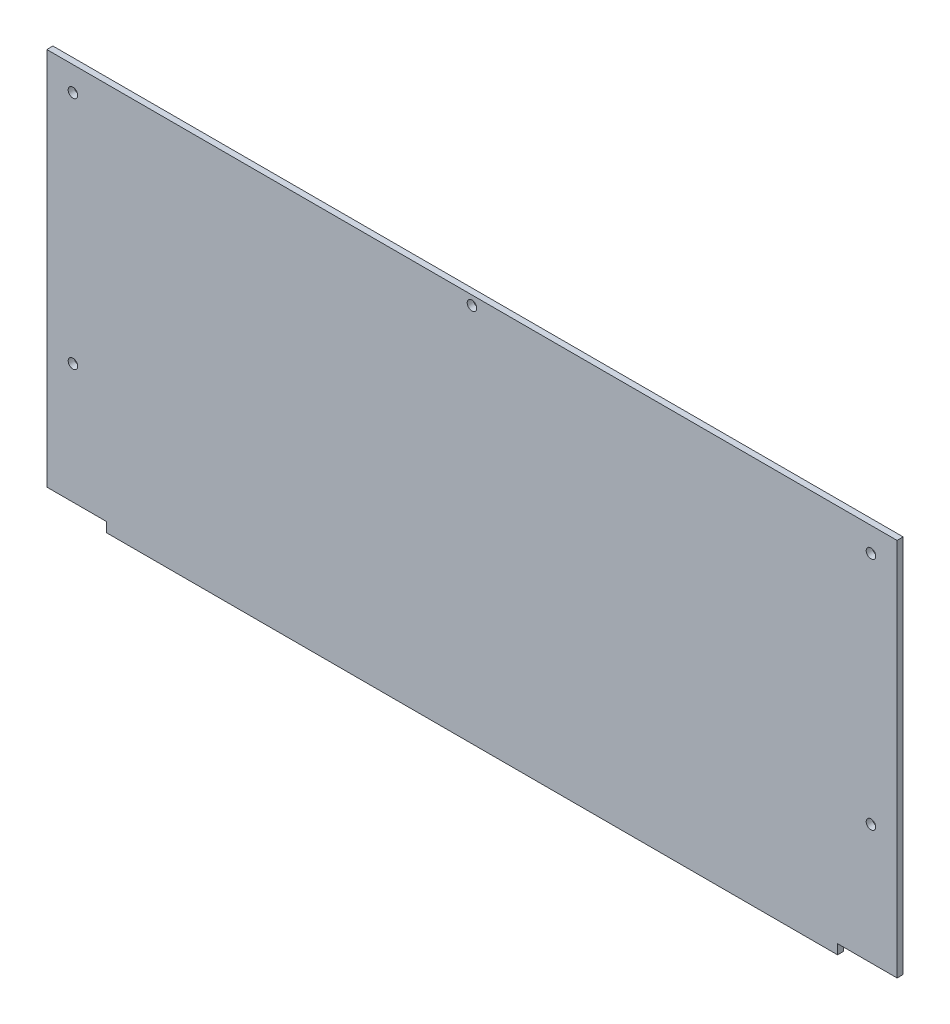
ISO-10303-21;
HEADER;
FILE_DESCRIPTION(('STEP AP214'),'2;1');
FILE_NAME('part.step','',(''),(''),'','','');
FILE_SCHEMA(('AUTOMOTIVE_DESIGN { 1 0 10303 214 1 1 1 1 }'));
ENDSEC;
DATA;
#1=APPLICATION_CONTEXT('core data for automotive mechanical design processes');
#2=APPLICATION_PROTOCOL_DEFINITION('international standard','automotive_design',2000,#1);
#3=PRODUCT_CONTEXT('',#1,'mechanical');
#4=PRODUCT('Part','Part','',(#3));
#5=PRODUCT_RELATED_PRODUCT_CATEGORY('part','',(#4));
#6=PRODUCT_DEFINITION_FORMATION('','',#4);
#7=PRODUCT_DEFINITION_CONTEXT('part definition',#1,'design');
#8=PRODUCT_DEFINITION('design','',#6,#7);
#9=PRODUCT_DEFINITION_SHAPE('','',#8);
#10=(LENGTH_UNIT() NAMED_UNIT(*) SI_UNIT(.MILLI.,.METRE.));
#11=(NAMED_UNIT(*) PLANE_ANGLE_UNIT() SI_UNIT($,.RADIAN.));
#12=(NAMED_UNIT(*) SI_UNIT($,.STERADIAN.) SOLID_ANGLE_UNIT());
#13=UNCERTAINTY_MEASURE_WITH_UNIT(LENGTH_MEASURE(1.E-05),#10,'distance_accuracy_value','');
#14=(GEOMETRIC_REPRESENTATION_CONTEXT(3) GLOBAL_UNCERTAINTY_ASSIGNED_CONTEXT((#13)) GLOBAL_UNIT_ASSIGNED_CONTEXT((#10,
#11,#12)) REPRESENTATION_CONTEXT('',''));
#15=CARTESIAN_POINT('',(0.,0.,0.));
#16=DIRECTION('',(0.,0.,1.));
#17=DIRECTION('',(1.,0.,0.));
#18=AXIS2_PLACEMENT_3D('',#15,#16,#17);
#19=CARTESIAN_POINT('',(0.,0.,-1.5875));
#20=DIRECTION('',(0.,0.,1.));
#21=DIRECTION('',(1.,0.,0.));
#22=AXIS2_PLACEMENT_3D('',#19,#20,#21);
#23=PLANE('',#22);
#24=CARTESIAN_POINT('',(0.,96.8375,-1.5875));
#25=DIRECTION('',(0.,0.,-1.));
#26=DIRECTION('',(-1.,0.,0.));
#27=AXIS2_PLACEMENT_3D('',#24,#25,#26);
#28=CIRCLE('',#27,2.48919999999999);
#29=CARTESIAN_POINT('',(-2.48919999999999,96.8375,-1.5875));
#30=VERTEX_POINT('',#29);
#31=EDGE_CURVE('E203',#30,#30,#28,.T.);
#32=ORIENTED_EDGE('',*,*,#31,.F.);
#33=EDGE_LOOP('',(#32));
#34=FACE_BOUND('',#33,.T.);
#35=CARTESIAN_POINT('',(208.5975,88.9,-1.5875));
#36=DIRECTION('',(0.,0.,-1.));
#37=DIRECTION('',(-1.,0.,0.));
#38=AXIS2_PLACEMENT_3D('',#35,#36,#37);
#39=CIRCLE('',#38,2.4892);
#40=CARTESIAN_POINT('',(206.1083,88.9,-1.5875));
#41=VERTEX_POINT('',#40);
#42=EDGE_CURVE('E197',#41,#41,#39,.T.);
#43=ORIENTED_EDGE('',*,*,#42,.F.);
#44=EDGE_LOOP('',(#43));
#45=FACE_BOUND('',#44,.T.);
#46=CARTESIAN_POINT('',(208.5975,-33.782,-1.5875));
#47=DIRECTION('',(0.,0.,-1.));
#48=DIRECTION('',(-1.,0.,0.));
#49=AXIS2_PLACEMENT_3D('',#46,#47,#48);
#50=CIRCLE('',#49,2.4892);
#51=CARTESIAN_POINT('',(206.1083,-33.782,-1.5875));
#52=VERTEX_POINT('',#51);
#53=EDGE_CURVE('E191',#52,#52,#50,.T.);
#54=ORIENTED_EDGE('',*,*,#53,.F.);
#55=EDGE_LOOP('',(#54));
#56=FACE_BOUND('',#55,.T.);
#57=DIRECTION('',(0.,1.,0.));
#58=VECTOR('',#57,1.);
#59=CARTESIAN_POINT('',(222.25,-101.6,-1.5875));
#60=LINE('',#59,#58);
#61=CARTESIAN_POINT('',(222.25,-96.52,-1.5875));
#62=VERTEX_POINT('',#61);
#63=CARTESIAN_POINT('',(222.25,101.6,-1.5875));
#64=VERTEX_POINT('',#63);
#65=EDGE_CURVE('E142',#62,#64,#60,.T.);
#66=ORIENTED_EDGE('',*,*,#65,.F.);
#67=DIRECTION('',(1.,0.,0.));
#68=VECTOR('',#67,1.);
#69=CARTESIAN_POINT('',(191.135,-96.52,-1.5875));
#70=LINE('',#69,#68);
#71=CARTESIAN_POINT('',(191.135,-96.52,-1.5875));
#72=VERTEX_POINT('',#71);
#73=EDGE_CURVE('E110',#72,#62,#70,.T.);
#74=ORIENTED_EDGE('',*,*,#73,.F.);
#75=DIRECTION('',(0.,1.,0.));
#76=VECTOR('',#75,1.);
#77=CARTESIAN_POINT('',(191.135,-101.6,-1.5875));
#78=LINE('',#77,#76);
#79=CARTESIAN_POINT('',(191.135,-101.6,-1.5875));
#80=VERTEX_POINT('',#79);
#81=EDGE_CURVE('E161',#80,#72,#78,.T.);
#82=ORIENTED_EDGE('',*,*,#81,.F.);
#83=DIRECTION('',(1.,0.,0.));
#84=VECTOR('',#83,1.);
#85=CARTESIAN_POINT('',(-222.25,-101.6,-1.5875));
#86=LINE('',#85,#84);
#87=CARTESIAN_POINT('',(-191.135,-101.6,-1.5875));
#88=VERTEX_POINT('',#87);
#89=EDGE_CURVE('E118',#88,#80,#86,.T.);
#90=ORIENTED_EDGE('',*,*,#89,.F.);
#91=DIRECTION('',(0.,-1.,0.));
#92=VECTOR('',#91,1.);
#93=CARTESIAN_POINT('',(-191.135,-96.52,-1.5875));
#94=LINE('',#93,#92);
#95=CARTESIAN_POINT('',(-191.135,-96.52,-1.5875));
#96=VERTEX_POINT('',#95);
#97=EDGE_CURVE('E159',#96,#88,#94,.T.);
#98=ORIENTED_EDGE('',*,*,#97,.F.);
#99=DIRECTION('',(1.,0.,0.));
#100=VECTOR('',#99,1.);
#101=CARTESIAN_POINT('',(-222.25,-96.52,-1.5875));
#102=LINE('',#101,#100);
#103=CARTESIAN_POINT('',(-222.25,-96.52,-1.5875));
#104=VERTEX_POINT('',#103);
#105=EDGE_CURVE('E158',#104,#96,#102,.T.);
#106=ORIENTED_EDGE('',*,*,#105,.F.);
#107=DIRECTION('',(0.,-1.,0.));
#108=VECTOR('',#107,1.);
#109=CARTESIAN_POINT('',(-222.25,-101.6,-1.5875));
#110=LINE('',#109,#108);
#111=CARTESIAN_POINT('',(-222.25,101.6,-1.5875));
#112=VERTEX_POINT('',#111);
#113=EDGE_CURVE('E127',#112,#104,#110,.T.);
#114=ORIENTED_EDGE('',*,*,#113,.F.);
#115=DIRECTION('',(-1.,0.,0.));
#116=VECTOR('',#115,1.);
#117=CARTESIAN_POINT('',(-222.25,101.6,-1.5875));
#118=LINE('',#117,#116);
#119=EDGE_CURVE('E132',#64,#112,#118,.T.);
#120=ORIENTED_EDGE('',*,*,#119,.F.);
#121=EDGE_LOOP('',(#66,#74,#82,#90,#98,#106,#114,#120));
#122=FACE_BOUND('',#121,.T.);
#123=CARTESIAN_POINT('',(-208.5975,-33.782,-1.5875));
#124=DIRECTION('',(0.,0.,-1.));
#125=DIRECTION('',(-1.,0.,0.));
#126=AXIS2_PLACEMENT_3D('',#123,#124,#125);
#127=CIRCLE('',#126,2.4892);
#128=CARTESIAN_POINT('',(-211.0867,-33.782,-1.5875));
#129=VERTEX_POINT('',#128);
#130=EDGE_CURVE('E179',#129,#129,#127,.T.);
#131=ORIENTED_EDGE('',*,*,#130,.F.);
#132=EDGE_LOOP('',(#131));
#133=FACE_BOUND('',#132,.T.);
#134=CARTESIAN_POINT('',(-208.5975,88.8999999999999,-1.5875));
#135=DIRECTION('',(0.,0.,-1.));
#136=DIRECTION('',(-1.,0.,0.));
#137=AXIS2_PLACEMENT_3D('',#134,#135,#136);
#138=CIRCLE('',#137,2.4892);
#139=CARTESIAN_POINT('',(-211.0867,88.8999999999999,-1.5875));
#140=VERTEX_POINT('',#139);
#141=EDGE_CURVE('E185',#140,#140,#138,.T.);
#142=ORIENTED_EDGE('',*,*,#141,.F.);
#143=EDGE_LOOP('',(#142));
#144=FACE_BOUND('',#143,.T.);
#145=ADVANCED_FACE('F37',(#34,#45,#56,#122,#133,#144),#23,.F.);
#146=CARTESIAN_POINT('',(0.,0.,1.5875));
#147=DIRECTION('',(0.,0.,1.));
#148=DIRECTION('',(1.,0.,0.));
#149=AXIS2_PLACEMENT_3D('',#146,#147,#148);
#150=PLANE('',#149);
#151=CARTESIAN_POINT('',(0.,96.8375,1.5875));
#152=DIRECTION('',(0.,0.,-1.));
#153=DIRECTION('',(-1.,0.,0.));
#154=AXIS2_PLACEMENT_3D('',#151,#152,#153);
#155=CIRCLE('',#154,2.48919999999999);
#156=CARTESIAN_POINT('',(-2.48919999999999,96.8375,1.5875));
#157=VERTEX_POINT('',#156);
#158=EDGE_CURVE('E200',#157,#157,#155,.T.);
#159=ORIENTED_EDGE('',*,*,#158,.T.);
#160=EDGE_LOOP('',(#159));
#161=FACE_BOUND('',#160,.T.);
#162=CARTESIAN_POINT('',(208.5975,88.9,1.5875));
#163=DIRECTION('',(0.,0.,-1.));
#164=DIRECTION('',(-1.,0.,0.));
#165=AXIS2_PLACEMENT_3D('',#162,#163,#164);
#166=CIRCLE('',#165,2.4892);
#167=CARTESIAN_POINT('',(206.1083,88.9,1.5875));
#168=VERTEX_POINT('',#167);
#169=EDGE_CURVE('E194',#168,#168,#166,.T.);
#170=ORIENTED_EDGE('',*,*,#169,.T.);
#171=EDGE_LOOP('',(#170));
#172=FACE_BOUND('',#171,.T.);
#173=CARTESIAN_POINT('',(208.5975,-33.782,1.5875));
#174=DIRECTION('',(0.,0.,-1.));
#175=DIRECTION('',(-1.,0.,0.));
#176=AXIS2_PLACEMENT_3D('',#173,#174,#175);
#177=CIRCLE('',#176,2.4892);
#178=CARTESIAN_POINT('',(206.1083,-33.782,1.5875));
#179=VERTEX_POINT('',#178);
#180=EDGE_CURVE('E188',#179,#179,#177,.T.);
#181=ORIENTED_EDGE('',*,*,#180,.T.);
#182=EDGE_LOOP('',(#181));
#183=FACE_BOUND('',#182,.T.);
#184=DIRECTION('',(1.,0.,0.));
#185=VECTOR('',#184,1.);
#186=CARTESIAN_POINT('',(191.135,-96.52,1.5875));
#187=LINE('',#186,#185);
#188=CARTESIAN_POINT('',(191.135,-96.52,1.5875));
#189=VERTEX_POINT('',#188);
#190=CARTESIAN_POINT('',(222.25,-96.52,1.5875));
#191=VERTEX_POINT('',#190);
#192=EDGE_CURVE('E109',#189,#191,#187,.T.);
#193=ORIENTED_EDGE('',*,*,#192,.T.);
#194=DIRECTION('',(0.,1.,0.));
#195=VECTOR('',#194,1.);
#196=CARTESIAN_POINT('',(222.25,-101.6,1.5875));
#197=LINE('',#196,#195);
#198=CARTESIAN_POINT('',(222.25,101.6,1.5875));
#199=VERTEX_POINT('',#198);
#200=EDGE_CURVE('E126',#191,#199,#197,.T.);
#201=ORIENTED_EDGE('',*,*,#200,.T.);
#202=DIRECTION('',(-1.,0.,0.));
#203=VECTOR('',#202,1.);
#204=CARTESIAN_POINT('',(-222.25,101.6,1.5875));
#205=LINE('',#204,#203);
#206=CARTESIAN_POINT('',(-222.25,101.6,1.5875));
#207=VERTEX_POINT('',#206);
#208=EDGE_CURVE('E129',#199,#207,#205,.T.);
#209=ORIENTED_EDGE('',*,*,#208,.T.);
#210=DIRECTION('',(0.,-1.,0.));
#211=VECTOR('',#210,1.);
#212=CARTESIAN_POINT('',(-222.25,-101.6,1.5875));
#213=LINE('',#212,#211);
#214=CARTESIAN_POINT('',(-222.25,-96.52,1.5875));
#215=VERTEX_POINT('',#214);
#216=EDGE_CURVE('E138',#207,#215,#213,.T.);
#217=ORIENTED_EDGE('',*,*,#216,.T.);
#218=DIRECTION('',(1.,0.,0.));
#219=VECTOR('',#218,1.);
#220=CARTESIAN_POINT('',(-222.25,-96.52,1.5875));
#221=LINE('',#220,#219);
#222=CARTESIAN_POINT('',(-191.135,-96.52,1.5875));
#223=VERTEX_POINT('',#222);
#224=EDGE_CURVE('E163',#215,#223,#221,.T.);
#225=ORIENTED_EDGE('',*,*,#224,.T.);
#226=DIRECTION('',(0.,-1.,0.));
#227=VECTOR('',#226,1.);
#228=CARTESIAN_POINT('',(-191.135,-96.52,1.5875));
#229=LINE('',#228,#227);
#230=CARTESIAN_POINT('',(-191.135,-101.6,1.5875));
#231=VERTEX_POINT('',#230);
#232=EDGE_CURVE('E125',#223,#231,#229,.T.);
#233=ORIENTED_EDGE('',*,*,#232,.T.);
#234=DIRECTION('',(1.,0.,0.));
#235=VECTOR('',#234,1.);
#236=CARTESIAN_POINT('',(-222.25,-101.6,1.5875));
#237=LINE('',#236,#235);
#238=CARTESIAN_POINT('',(191.135,-101.6,1.5875));
#239=VERTEX_POINT('',#238);
#240=EDGE_CURVE('E116',#231,#239,#237,.T.);
#241=ORIENTED_EDGE('',*,*,#240,.T.);
#242=DIRECTION('',(0.,1.,0.));
#243=VECTOR('',#242,1.);
#244=CARTESIAN_POINT('',(191.135,-101.6,1.5875));
#245=LINE('',#244,#243);
#246=EDGE_CURVE('E102',#239,#189,#245,.T.);
#247=ORIENTED_EDGE('',*,*,#246,.T.);
#248=EDGE_LOOP('',(#193,#201,#209,#217,#225,#233,#241,#247));
#249=FACE_BOUND('',#248,.T.);
#250=CARTESIAN_POINT('',(-208.5975,-33.782,1.5875));
#251=DIRECTION('',(0.,0.,-1.));
#252=DIRECTION('',(-1.,0.,0.));
#253=AXIS2_PLACEMENT_3D('',#250,#251,#252);
#254=CIRCLE('',#253,2.4892);
#255=CARTESIAN_POINT('',(-211.0867,-33.782,1.5875));
#256=VERTEX_POINT('',#255);
#257=EDGE_CURVE('E176',#256,#256,#254,.T.);
#258=ORIENTED_EDGE('',*,*,#257,.T.);
#259=EDGE_LOOP('',(#258));
#260=FACE_BOUND('',#259,.T.);
#261=CARTESIAN_POINT('',(-208.5975,88.8999999999999,1.5875));
#262=DIRECTION('',(0.,0.,-1.));
#263=DIRECTION('',(-1.,0.,0.));
#264=AXIS2_PLACEMENT_3D('',#261,#262,#263);
#265=CIRCLE('',#264,2.4892);
#266=CARTESIAN_POINT('',(-211.0867,88.8999999999999,1.5875));
#267=VERTEX_POINT('',#266);
#268=EDGE_CURVE('E182',#267,#267,#265,.T.);
#269=ORIENTED_EDGE('',*,*,#268,.T.);
#270=EDGE_LOOP('',(#269));
#271=FACE_BOUND('',#270,.T.);
#272=ADVANCED_FACE('F121',(#161,#172,#183,#249,#260,#271),#150,.T.);
#273=CARTESIAN_POINT('',(-222.25,-101.6,1.5875));
#274=DIRECTION('',(0.,1.,0.));
#275=DIRECTION('',(0.,0.,1.));
#276=AXIS2_PLACEMENT_3D('',#273,#274,#275);
#277=PLANE('',#276);
#278=ORIENTED_EDGE('',*,*,#89,.T.);
#279=DIRECTION('',(0.,0.,-1.));
#280=VECTOR('',#279,1.);
#281=CARTESIAN_POINT('',(191.135,-101.6,1.5875));
#282=LINE('',#281,#280);
#283=EDGE_CURVE('E60',#239,#80,#282,.T.);
#284=ORIENTED_EDGE('',*,*,#283,.F.);
#285=ORIENTED_EDGE('',*,*,#240,.F.);
#286=DIRECTION('',(0.,0.,-1.));
#287=VECTOR('',#286,1.);
#288=CARTESIAN_POINT('',(-191.135,-101.6,1.5875));
#289=LINE('',#288,#287);
#290=EDGE_CURVE('E167',#231,#88,#289,.T.);
#291=ORIENTED_EDGE('',*,*,#290,.T.);
#292=EDGE_LOOP('',(#278,#284,#285,#291));
#293=FACE_BOUND('',#292,.T.);
#294=ADVANCED_FACE('F39',(#293),#277,.F.);
#295=CARTESIAN_POINT('',(222.25,-101.6,1.5875));
#296=DIRECTION('',(-1.,0.,0.));
#297=DIRECTION('',(0.,0.,1.));
#298=AXIS2_PLACEMENT_3D('',#295,#296,#297);
#299=PLANE('',#298);
#300=ORIENTED_EDGE('',*,*,#200,.F.);
#301=DIRECTION('',(0.,0.,-1.));
#302=VECTOR('',#301,1.);
#303=CARTESIAN_POINT('',(222.25,-96.52,1.5875));
#304=LINE('',#303,#302);
#305=EDGE_CURVE('E143',#191,#62,#304,.T.);
#306=ORIENTED_EDGE('',*,*,#305,.T.);
#307=ORIENTED_EDGE('',*,*,#65,.T.);
#308=DIRECTION('',(0.,0.,-1.));
#309=VECTOR('',#308,1.);
#310=CARTESIAN_POINT('',(222.25,101.6,1.5875));
#311=LINE('',#310,#309);
#312=EDGE_CURVE('E11',#199,#64,#311,.T.);
#313=ORIENTED_EDGE('',*,*,#312,.F.);
#314=EDGE_LOOP('',(#300,#306,#307,#313));
#315=FACE_BOUND('',#314,.T.);
#316=ADVANCED_FACE('F257',(#315),#299,.F.);
#317=CARTESIAN_POINT('',(-222.25,101.6,1.5875));
#318=DIRECTION('',(0.,-1.,0.));
#319=DIRECTION('',(0.,0.,-1.));
#320=AXIS2_PLACEMENT_3D('',#317,#318,#319);
#321=PLANE('',#320);
#322=ORIENTED_EDGE('',*,*,#119,.T.);
#323=DIRECTION('',(0.,0.,-1.));
#324=VECTOR('',#323,1.);
#325=CARTESIAN_POINT('',(-222.25,101.6,1.5875));
#326=LINE('',#325,#324);
#327=EDGE_CURVE('E45',#207,#112,#326,.T.);
#328=ORIENTED_EDGE('',*,*,#327,.F.);
#329=ORIENTED_EDGE('',*,*,#208,.F.);
#330=ORIENTED_EDGE('',*,*,#312,.T.);
#331=EDGE_LOOP('',(#322,#328,#329,#330));
#332=FACE_BOUND('',#331,.T.);
#333=ADVANCED_FACE('F255',(#332),#321,.F.);
#334=CARTESIAN_POINT('',(-222.25,-101.6,1.5875));
#335=DIRECTION('',(1.,0.,0.));
#336=DIRECTION('',(0.,0.,-1.));
#337=AXIS2_PLACEMENT_3D('',#334,#335,#336);
#338=PLANE('',#337);
#339=ORIENTED_EDGE('',*,*,#113,.T.);
#340=DIRECTION('',(0.,0.,-1.));
#341=VECTOR('',#340,1.);
#342=CARTESIAN_POINT('',(-222.25,-96.52,1.5875));
#343=LINE('',#342,#341);
#344=EDGE_CURVE('E52',#215,#104,#343,.T.);
#345=ORIENTED_EDGE('',*,*,#344,.F.);
#346=ORIENTED_EDGE('',*,*,#216,.F.);
#347=ORIENTED_EDGE('',*,*,#327,.T.);
#348=EDGE_LOOP('',(#339,#345,#346,#347));
#349=FACE_BOUND('',#348,.T.);
#350=ADVANCED_FACE('F150',(#349),#338,.F.);
#351=CARTESIAN_POINT('',(-191.135,-96.52,1.5875));
#352=DIRECTION('',(1.,0.,0.));
#353=DIRECTION('',(0.,1.,0.));
#354=AXIS2_PLACEMENT_3D('',#351,#352,#353);
#355=PLANE('',#354);
#356=ORIENTED_EDGE('',*,*,#97,.T.);
#357=ORIENTED_EDGE('',*,*,#290,.F.);
#358=ORIENTED_EDGE('',*,*,#232,.F.);
#359=DIRECTION('',(0.,0.,-1.));
#360=VECTOR('',#359,1.);
#361=CARTESIAN_POINT('',(-191.135,-96.52,1.5875));
#362=LINE('',#361,#360);
#363=EDGE_CURVE('E165',#223,#96,#362,.T.);
#364=ORIENTED_EDGE('',*,*,#363,.T.);
#365=EDGE_LOOP('',(#356,#357,#358,#364));
#366=FACE_BOUND('',#365,.T.);
#367=ADVANCED_FACE('F244',(#366),#355,.F.);
#368=CARTESIAN_POINT('',(-222.25,-96.52,1.5875));
#369=DIRECTION('',(0.,1.,0.));
#370=DIRECTION('',(0.,0.,1.));
#371=AXIS2_PLACEMENT_3D('',#368,#369,#370);
#372=PLANE('',#371);
#373=ORIENTED_EDGE('',*,*,#105,.T.);
#374=ORIENTED_EDGE('',*,*,#363,.F.);
#375=ORIENTED_EDGE('',*,*,#224,.F.);
#376=ORIENTED_EDGE('',*,*,#344,.T.);
#377=EDGE_LOOP('',(#373,#374,#375,#376));
#378=FACE_BOUND('',#377,.T.);
#379=ADVANCED_FACE('F240',(#378),#372,.F.);
#380=CARTESIAN_POINT('',(191.135,-96.52,1.5875));
#381=DIRECTION('',(0.,1.,0.));
#382=DIRECTION('',(0.,0.,1.));
#383=AXIS2_PLACEMENT_3D('',#380,#381,#382);
#384=PLANE('',#383);
#385=ORIENTED_EDGE('',*,*,#73,.T.);
#386=ORIENTED_EDGE('',*,*,#305,.F.);
#387=ORIENTED_EDGE('',*,*,#192,.F.);
#388=DIRECTION('',(0.,0.,-1.));
#389=VECTOR('',#388,1.);
#390=CARTESIAN_POINT('',(191.135,-96.52,1.5875));
#391=LINE('',#390,#389);
#392=EDGE_CURVE('E104',#189,#72,#391,.T.);
#393=ORIENTED_EDGE('',*,*,#392,.T.);
#394=EDGE_LOOP('',(#385,#386,#387,#393));
#395=FACE_BOUND('',#394,.T.);
#396=ADVANCED_FACE('F237',(#395),#384,.F.);
#397=CARTESIAN_POINT('',(191.135,-101.6,1.5875));
#398=DIRECTION('',(-1.,0.,0.));
#399=DIRECTION('',(0.,0.,1.));
#400=AXIS2_PLACEMENT_3D('',#397,#398,#399);
#401=PLANE('',#400);
#402=ORIENTED_EDGE('',*,*,#81,.T.);
#403=ORIENTED_EDGE('',*,*,#392,.F.);
#404=ORIENTED_EDGE('',*,*,#246,.F.);
#405=ORIENTED_EDGE('',*,*,#283,.T.);
#406=EDGE_LOOP('',(#402,#403,#404,#405));
#407=FACE_BOUND('',#406,.T.);
#408=ADVANCED_FACE('F103',(#407),#401,.F.);
#409=CARTESIAN_POINT('',(-208.5975,-33.782,-1.5875));
#410=DIRECTION('',(0.,0.,-1.));
#411=DIRECTION('',(-1.,0.,0.));
#412=AXIS2_PLACEMENT_3D('',#409,#410,#411);
#413=CYLINDRICAL_SURFACE('',#412,2.4892);
#414=ORIENTED_EDGE('',*,*,#257,.F.);
#415=EDGE_LOOP('',(#414));
#416=FACE_BOUND('',#415,.T.);
#417=ORIENTED_EDGE('',*,*,#130,.T.);
#418=EDGE_LOOP('',(#417));
#419=FACE_BOUND('',#418,.T.);
#420=ADVANCED_FACE('F228',(#416,#419),#413,.F.);
#421=CARTESIAN_POINT('',(-208.5975,88.8999999999999,-1.5875));
#422=DIRECTION('',(0.,0.,-1.));
#423=DIRECTION('',(-1.,0.,0.));
#424=AXIS2_PLACEMENT_3D('',#421,#422,#423);
#425=CYLINDRICAL_SURFACE('',#424,2.4892);
#426=ORIENTED_EDGE('',*,*,#268,.F.);
#427=EDGE_LOOP('',(#426));
#428=FACE_BOUND('',#427,.T.);
#429=ORIENTED_EDGE('',*,*,#141,.T.);
#430=EDGE_LOOP('',(#429));
#431=FACE_BOUND('',#430,.T.);
#432=ADVANCED_FACE('F219',(#428,#431),#425,.F.);
#433=CARTESIAN_POINT('',(208.5975,-33.782,-1.5875));
#434=DIRECTION('',(0.,0.,-1.));
#435=DIRECTION('',(-1.,0.,0.));
#436=AXIS2_PLACEMENT_3D('',#433,#434,#435);
#437=CYLINDRICAL_SURFACE('',#436,2.4892);
#438=ORIENTED_EDGE('',*,*,#180,.F.);
#439=EDGE_LOOP('',(#438));
#440=FACE_BOUND('',#439,.T.);
#441=ORIENTED_EDGE('',*,*,#53,.T.);
#442=EDGE_LOOP('',(#441));
#443=FACE_BOUND('',#442,.T.);
#444=ADVANCED_FACE('F216',(#440,#443),#437,.F.);
#445=CARTESIAN_POINT('',(208.5975,88.9,-1.5875));
#446=DIRECTION('',(0.,0.,-1.));
#447=DIRECTION('',(-1.,0.,0.));
#448=AXIS2_PLACEMENT_3D('',#445,#446,#447);
#449=CYLINDRICAL_SURFACE('',#448,2.4892);
#450=ORIENTED_EDGE('',*,*,#169,.F.);
#451=EDGE_LOOP('',(#450));
#452=FACE_BOUND('',#451,.T.);
#453=ORIENTED_EDGE('',*,*,#42,.T.);
#454=EDGE_LOOP('',(#453));
#455=FACE_BOUND('',#454,.T.);
#456=ADVANCED_FACE('F218',(#452,#455),#449,.F.);
#457=CARTESIAN_POINT('',(0.,96.8375,-1.5875));
#458=DIRECTION('',(0.,0.,-1.));
#459=DIRECTION('',(-1.,0.,0.));
#460=AXIS2_PLACEMENT_3D('',#457,#458,#459);
#461=CYLINDRICAL_SURFACE('',#460,2.48919999999999);
#462=ORIENTED_EDGE('',*,*,#158,.F.);
#463=EDGE_LOOP('',(#462));
#464=FACE_BOUND('',#463,.T.);
#465=ORIENTED_EDGE('',*,*,#31,.T.);
#466=EDGE_LOOP('',(#465));
#467=FACE_BOUND('',#466,.T.);
#468=ADVANCED_FACE('F207',(#464,#467),#461,.F.);
#469=CLOSED_SHELL('',(#145,#272,#294,#316,#333,#350,#367,#379,#396,#408,#420,#432,#444,#456,#468));
#470=MANIFOLD_SOLID_BREP('B2',#469);
#471=ADVANCED_BREP_SHAPE_REPRESENTATION('',(#18,#470),#14);
#472=SHAPE_DEFINITION_REPRESENTATION(#9,#471);
ENDSEC;
END-ISO-10303-21;
